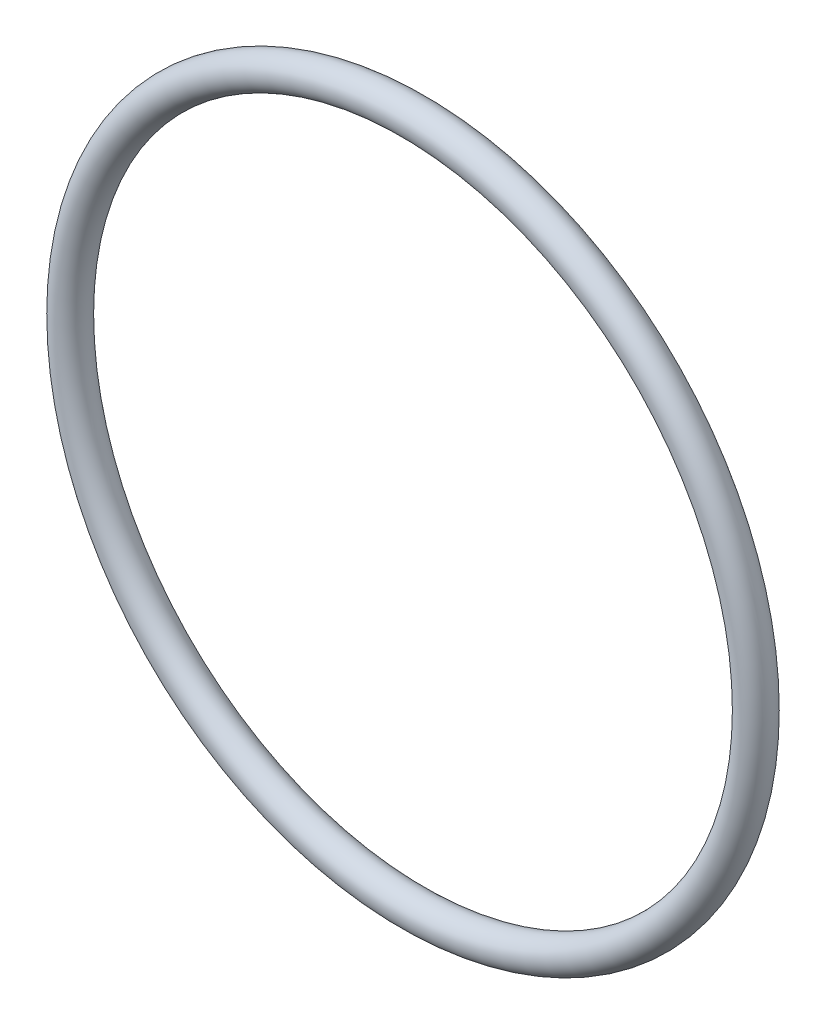
ISO-10303-21;
HEADER;
FILE_DESCRIPTION(('STEP AP214'),'2;1');
FILE_NAME('part.step','',(''),(''),'','','');
FILE_SCHEMA(('AUTOMOTIVE_DESIGN { 1 0 10303 214 1 1 1 1 }'));
ENDSEC;
DATA;
#1=APPLICATION_CONTEXT('core data for automotive mechanical design processes');
#2=APPLICATION_PROTOCOL_DEFINITION('international standard','automotive_design',2000,#1);
#3=PRODUCT_CONTEXT('',#1,'mechanical');
#4=PRODUCT('Part','Part','',(#3));
#5=PRODUCT_RELATED_PRODUCT_CATEGORY('part','',(#4));
#6=PRODUCT_DEFINITION_FORMATION('','',#4);
#7=PRODUCT_DEFINITION_CONTEXT('part definition',#1,'design');
#8=PRODUCT_DEFINITION('design','',#6,#7);
#9=PRODUCT_DEFINITION_SHAPE('','',#8);
#10=(LENGTH_UNIT() NAMED_UNIT(*) SI_UNIT(.MILLI.,.METRE.));
#11=(NAMED_UNIT(*) PLANE_ANGLE_UNIT() SI_UNIT($,.RADIAN.));
#12=(NAMED_UNIT(*) SI_UNIT($,.STERADIAN.) SOLID_ANGLE_UNIT());
#13=UNCERTAINTY_MEASURE_WITH_UNIT(LENGTH_MEASURE(1.E-05),#10,'distance_accuracy_value','');
#14=(GEOMETRIC_REPRESENTATION_CONTEXT(3) GLOBAL_UNCERTAINTY_ASSIGNED_CONTEXT((#13)) GLOBAL_UNIT_ASSIGNED_CONTEXT((#10,
#11,#12)) REPRESENTATION_CONTEXT('',''));
#15=CARTESIAN_POINT('',(0.,0.,0.));
#16=DIRECTION('',(0.,0.,1.));
#17=DIRECTION('',(1.,0.,0.));
#18=AXIS2_PLACEMENT_3D('',#15,#16,#17);
#19=CARTESIAN_POINT('',(0.,0.,0.));
#20=DIRECTION('',(0.,0.,1.));
#21=DIRECTION('',(1.,0.,0.));
#22=AXIS2_PLACEMENT_3D('',#19,#20,#21);
#23=TOROIDAL_SURFACE('',#22,36.4871,1.76530000000001);
#24=CARTESIAN_POINT('',(38.2524,0.,0.));
#25=VERTEX_POINT('',#24);
#26=VERTEX_LOOP('',#25);
#27=FACE_BOUND('',#26,.T.);
#28=ADVANCED_FACE('F26',(#27),#23,.T.);
#29=CLOSED_SHELL('',(#28));
#30=MANIFOLD_SOLID_BREP('B2',#29);
#31=ADVANCED_BREP_SHAPE_REPRESENTATION('',(#18,#30),#14);
#32=SHAPE_DEFINITION_REPRESENTATION(#9,#31);
ENDSEC;
END-ISO-10303-21;
